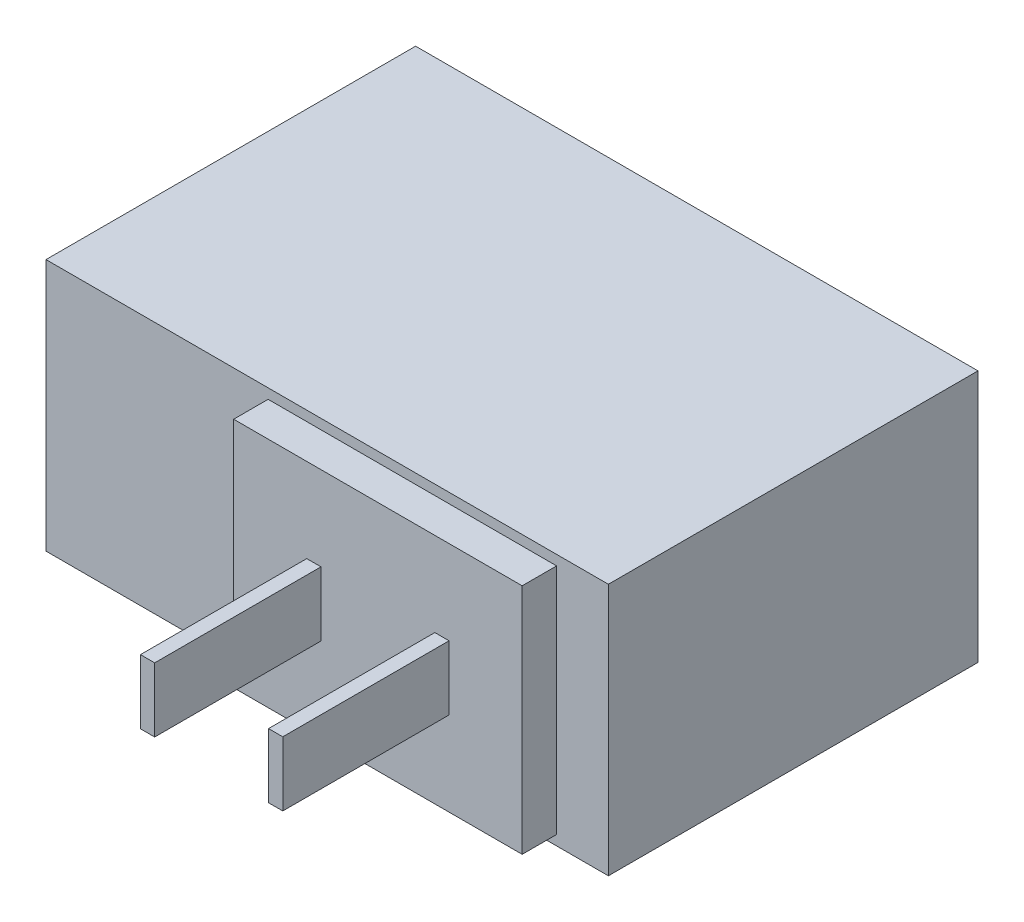
ISO-10303-21;
HEADER;
FILE_DESCRIPTION(('STEP AP214'),'2;1');
FILE_NAME('part.step','',(''),(''),'','','');
FILE_SCHEMA(('AUTOMOTIVE_DESIGN { 1 0 10303 214 1 1 1 1 }'));
ENDSEC;
DATA;
#1=APPLICATION_CONTEXT('core data for automotive mechanical design processes');
#2=APPLICATION_PROTOCOL_DEFINITION('international standard','automotive_design',2000,#1);
#3=PRODUCT_CONTEXT('',#1,'mechanical');
#4=PRODUCT('Part','Part','',(#3));
#5=PRODUCT_RELATED_PRODUCT_CATEGORY('part','',(#4));
#6=PRODUCT_DEFINITION_FORMATION('','',#4);
#7=PRODUCT_DEFINITION_CONTEXT('part definition',#1,'design');
#8=PRODUCT_DEFINITION('design','',#6,#7);
#9=PRODUCT_DEFINITION_SHAPE('','',#8);
#10=(LENGTH_UNIT() NAMED_UNIT(*) SI_UNIT(.MILLI.,.METRE.));
#11=(NAMED_UNIT(*) PLANE_ANGLE_UNIT() SI_UNIT($,.RADIAN.));
#12=(NAMED_UNIT(*) SI_UNIT($,.STERADIAN.) SOLID_ANGLE_UNIT());
#13=UNCERTAINTY_MEASURE_WITH_UNIT(LENGTH_MEASURE(1.E-05),#10,'distance_accuracy_value','');
#14=(GEOMETRIC_REPRESENTATION_CONTEXT(3) GLOBAL_UNCERTAINTY_ASSIGNED_CONTEXT((#13)) GLOBAL_UNIT_ASSIGNED_CONTEXT((#10,
#11,#12)) REPRESENTATION_CONTEXT('',''));
#15=CARTESIAN_POINT('',(0.,0.,0.));
#16=DIRECTION('',(0.,0.,1.));
#17=DIRECTION('',(1.,0.,0.));
#18=AXIS2_PLACEMENT_3D('',#15,#16,#17);
#19=CARTESIAN_POINT('',(0.,0.,39.75));
#20=DIRECTION('',(0.,0.,-1.));
#21=DIRECTION('',(-1.,0.,0.));
#22=AXIS2_PLACEMENT_3D('',#19,#20,#21);
#23=PLANE('',#22);
#24=DIRECTION('',(0.,-1.,0.));
#25=VECTOR('',#24,1.);
#26=CARTESIAN_POINT('',(13.98,3.15999999999999,39.75));
#27=LINE('',#26,#25);
#28=CARTESIAN_POINT('',(13.98,3.15999999999999,39.75));
#29=VERTEX_POINT('',#28);
#30=CARTESIAN_POINT('',(13.98,-3.16000000000001,39.75));
#31=VERTEX_POINT('',#30);
#32=EDGE_CURVE('E167',#29,#31,#27,.T.);
#33=ORIENTED_EDGE('',*,*,#32,.F.);
#34=DIRECTION('',(-1.,0.,0.));
#35=VECTOR('',#34,1.);
#36=CARTESIAN_POINT('',(13.98,3.15999999999999,39.75));
#37=LINE('',#36,#35);
#38=CARTESIAN_POINT('',(15.38,3.15999999999999,39.75));
#39=VERTEX_POINT('',#38);
#40=EDGE_CURVE('E180',#39,#29,#37,.T.);
#41=ORIENTED_EDGE('',*,*,#40,.F.);
#42=DIRECTION('',(0.,1.,0.));
#43=VECTOR('',#42,1.);
#44=CARTESIAN_POINT('',(15.38,3.15999999999999,39.75));
#45=LINE('',#44,#43);
#46=CARTESIAN_POINT('',(15.38,-3.16000000000001,39.75));
#47=VERTEX_POINT('',#46);
#48=EDGE_CURVE('E189',#47,#39,#45,.T.);
#49=ORIENTED_EDGE('',*,*,#48,.F.);
#50=DIRECTION('',(1.,0.,0.));
#51=VECTOR('',#50,1.);
#52=CARTESIAN_POINT('',(13.98,-3.16000000000001,39.75));
#53=LINE('',#52,#51);
#54=EDGE_CURVE('E170',#31,#47,#53,.T.);
#55=ORIENTED_EDGE('',*,*,#54,.F.);
#56=EDGE_LOOP('',(#33,#41,#49,#55));
#57=FACE_BOUND('',#56,.T.);
#58=DIRECTION('',(0.,1.,0.));
#59=VECTOR('',#58,1.);
#60=CARTESIAN_POINT('',(22.57,11.44,39.75));
#61=LINE('',#60,#59);
#62=CARTESIAN_POINT('',(22.57,-11.44,39.75));
#63=VERTEX_POINT('',#62);
#64=CARTESIAN_POINT('',(22.57,11.44,39.75));
#65=VERTEX_POINT('',#64);
#66=EDGE_CURVE('E206',#63,#65,#61,.T.);
#67=ORIENTED_EDGE('',*,*,#66,.T.);
#68=DIRECTION('',(-1.,0.,0.));
#69=VECTOR('',#68,1.);
#70=CARTESIAN_POINT('',(22.57,11.44,39.75));
#71=LINE('',#70,#69);
#72=CARTESIAN_POINT('',(-5.80999999999999,11.44,39.75));
#73=VERTEX_POINT('',#72);
#74=EDGE_CURVE('E209',#65,#73,#71,.T.);
#75=ORIENTED_EDGE('',*,*,#74,.T.);
#76=DIRECTION('',(0.,-1.,0.));
#77=VECTOR('',#76,1.);
#78=CARTESIAN_POINT('',(-5.80999999999999,11.44,39.75));
#79=LINE('',#78,#77);
#80=CARTESIAN_POINT('',(-5.80999999999999,-11.44,39.75));
#81=VERTEX_POINT('',#80);
#82=EDGE_CURVE('E212',#73,#81,#79,.T.);
#83=ORIENTED_EDGE('',*,*,#82,.T.);
#84=DIRECTION('',(1.,0.,0.));
#85=VECTOR('',#84,1.);
#86=CARTESIAN_POINT('',(22.57,-11.44,39.75));
#87=LINE('',#86,#85);
#88=EDGE_CURVE('E214',#81,#63,#87,.T.);
#89=ORIENTED_EDGE('',*,*,#88,.T.);
#90=EDGE_LOOP('',(#67,#75,#83,#89));
#91=FACE_BOUND('',#90,.T.);
#92=DIRECTION('',(0.,-1.,0.));
#93=VECTOR('',#92,1.);
#94=CARTESIAN_POINT('',(1.38000000000001,3.15999999999999,39.75));
#95=LINE('',#94,#93);
#96=CARTESIAN_POINT('',(1.38000000000001,3.15999999999999,39.75));
#97=VERTEX_POINT('',#96);
#98=CARTESIAN_POINT('',(1.38000000000001,-3.16000000000001,39.75));
#99=VERTEX_POINT('',#98);
#100=EDGE_CURVE('E166',#97,#99,#95,.T.);
#101=ORIENTED_EDGE('',*,*,#100,.F.);
#102=DIRECTION('',(-1.,0.,0.));
#103=VECTOR('',#102,1.);
#104=CARTESIAN_POINT('',(1.38000000000001,3.15999999999999,39.75));
#105=LINE('',#104,#103);
#106=CARTESIAN_POINT('',(2.78000000000001,3.15999999999999,39.75));
#107=VERTEX_POINT('',#106);
#108=EDGE_CURVE('E163',#107,#97,#105,.T.);
#109=ORIENTED_EDGE('',*,*,#108,.F.);
#110=DIRECTION('',(0.,1.,0.));
#111=VECTOR('',#110,1.);
#112=CARTESIAN_POINT('',(2.78000000000001,3.15999999999999,39.75));
#113=LINE('',#112,#111);
#114=CARTESIAN_POINT('',(2.78000000000001,-3.16000000000001,39.75));
#115=VERTEX_POINT('',#114);
#116=EDGE_CURVE('E53',#115,#107,#113,.T.);
#117=ORIENTED_EDGE('',*,*,#116,.F.);
#118=DIRECTION('',(1.,0.,0.));
#119=VECTOR('',#118,1.);
#120=CARTESIAN_POINT('',(1.38000000000001,-3.16000000000001,39.75));
#121=LINE('',#120,#119);
#122=EDGE_CURVE('E48',#99,#115,#121,.T.);
#123=ORIENTED_EDGE('',*,*,#122,.F.);
#124=EDGE_LOOP('',(#101,#109,#117,#123));
#125=FACE_BOUND('',#124,.T.);
#126=ADVANCED_FACE('F33',(#57,#91,#125),#23,.F.);
#127=CARTESIAN_POINT('',(-27.66,-12.42,36.36));
#128=DIRECTION('',(1.,0.,0.));
#129=DIRECTION('',(0.,0.,-1.));
#130=AXIS2_PLACEMENT_3D('',#127,#128,#129);
#131=PLANE('',#130);
#132=DIRECTION('',(0.,-1.,0.));
#133=VECTOR('',#132,1.);
#134=CARTESIAN_POINT('',(-27.66,-12.42,0.));
#135=LINE('',#134,#133);
#136=CARTESIAN_POINT('',(-27.66,12.42,0.));
#137=VERTEX_POINT('',#136);
#138=CARTESIAN_POINT('',(-27.66,-12.42,0.));
#139=VERTEX_POINT('',#138);
#140=EDGE_CURVE('E238',#137,#139,#135,.T.);
#141=ORIENTED_EDGE('',*,*,#140,.T.);
#142=DIRECTION('',(0.,0.,-1.));
#143=VECTOR('',#142,1.);
#144=CARTESIAN_POINT('',(-27.66,-12.42,36.36));
#145=LINE('',#144,#143);
#146=CARTESIAN_POINT('',(-27.66,-12.42,36.36));
#147=VERTEX_POINT('',#146);
#148=EDGE_CURVE('E11',#147,#139,#145,.T.);
#149=ORIENTED_EDGE('',*,*,#148,.F.);
#150=DIRECTION('',(0.,-1.,0.));
#151=VECTOR('',#150,1.);
#152=CARTESIAN_POINT('',(-27.66,-12.42,36.36));
#153=LINE('',#152,#151);
#154=CARTESIAN_POINT('',(-27.66,12.42,36.36));
#155=VERTEX_POINT('',#154);
#156=EDGE_CURVE('E239',#155,#147,#153,.T.);
#157=ORIENTED_EDGE('',*,*,#156,.F.);
#158=DIRECTION('',(0.,0.,-1.));
#159=VECTOR('',#158,1.);
#160=CARTESIAN_POINT('',(-27.66,12.42,36.36));
#161=LINE('',#160,#159);
#162=EDGE_CURVE('E249',#155,#137,#161,.T.);
#163=ORIENTED_EDGE('',*,*,#162,.T.);
#164=EDGE_LOOP('',(#141,#149,#157,#163));
#165=FACE_BOUND('',#164,.T.);
#166=ADVANCED_FACE('F35',(#165),#131,.F.);
#167=CARTESIAN_POINT('',(27.66,-12.42,36.36));
#168=DIRECTION('',(0.,1.,0.));
#169=DIRECTION('',(-1.,0.,0.));
#170=AXIS2_PLACEMENT_3D('',#167,#168,#169);
#171=PLANE('',#170);
#172=DIRECTION('',(1.,0.,0.));
#173=VECTOR('',#172,1.);
#174=CARTESIAN_POINT('',(27.66,-12.42,0.));
#175=LINE('',#174,#173);
#176=CARTESIAN_POINT('',(27.66,-12.42,0.));
#177=VERTEX_POINT('',#176);
#178=EDGE_CURVE('E252',#139,#177,#175,.T.);
#179=ORIENTED_EDGE('',*,*,#178,.T.);
#180=DIRECTION('',(0.,0.,-1.));
#181=VECTOR('',#180,1.);
#182=CARTESIAN_POINT('',(27.66,-12.42,36.36));
#183=LINE('',#182,#181);
#184=CARTESIAN_POINT('',(27.66,-12.42,36.36));
#185=VERTEX_POINT('',#184);
#186=EDGE_CURVE('E41',#185,#177,#183,.T.);
#187=ORIENTED_EDGE('',*,*,#186,.F.);
#188=DIRECTION('',(1.,0.,0.));
#189=VECTOR('',#188,1.);
#190=CARTESIAN_POINT('',(27.66,-12.42,36.36));
#191=LINE('',#190,#189);
#192=EDGE_CURVE('E242',#147,#185,#191,.T.);
#193=ORIENTED_EDGE('',*,*,#192,.F.);
#194=ORIENTED_EDGE('',*,*,#148,.T.);
#195=EDGE_LOOP('',(#179,#187,#193,#194));
#196=FACE_BOUND('',#195,.T.);
#197=ADVANCED_FACE('F282',(#196),#171,.F.);
#198=CARTESIAN_POINT('',(27.66,-12.42,36.36));
#199=DIRECTION('',(-1.,0.,0.));
#200=DIRECTION('',(0.,-1.,0.));
#201=AXIS2_PLACEMENT_3D('',#198,#199,#200);
#202=PLANE('',#201);
#203=DIRECTION('',(0.,1.,0.));
#204=VECTOR('',#203,1.);
#205=CARTESIAN_POINT('',(27.66,-12.42,0.));
#206=LINE('',#205,#204);
#207=CARTESIAN_POINT('',(27.66,12.42,0.));
#208=VERTEX_POINT('',#207);
#209=EDGE_CURVE('E254',#177,#208,#206,.T.);
#210=ORIENTED_EDGE('',*,*,#209,.T.);
#211=DIRECTION('',(0.,0.,-1.));
#212=VECTOR('',#211,1.);
#213=CARTESIAN_POINT('',(27.66,12.42,36.36));
#214=LINE('',#213,#212);
#215=CARTESIAN_POINT('',(27.66,12.42,36.36));
#216=VERTEX_POINT('',#215);
#217=EDGE_CURVE('E259',#216,#208,#214,.T.);
#218=ORIENTED_EDGE('',*,*,#217,.F.);
#219=DIRECTION('',(0.,1.,0.));
#220=VECTOR('',#219,1.);
#221=CARTESIAN_POINT('',(27.66,-12.42,36.36));
#222=LINE('',#221,#220);
#223=EDGE_CURVE('E245',#185,#216,#222,.T.);
#224=ORIENTED_EDGE('',*,*,#223,.F.);
#225=ORIENTED_EDGE('',*,*,#186,.T.);
#226=EDGE_LOOP('',(#210,#218,#224,#225));
#227=FACE_BOUND('',#226,.T.);
#228=ADVANCED_FACE('F266',(#227),#202,.F.);
#229=CARTESIAN_POINT('',(27.66,12.42,36.36));
#230=DIRECTION('',(0.,-1.,0.));
#231=DIRECTION('',(1.,0.,0.));
#232=AXIS2_PLACEMENT_3D('',#229,#230,#231);
#233=PLANE('',#232);
#234=DIRECTION('',(-1.,0.,0.));
#235=VECTOR('',#234,1.);
#236=CARTESIAN_POINT('',(27.66,12.42,0.));
#237=LINE('',#236,#235);
#238=EDGE_CURVE('E243',#208,#137,#237,.T.);
#239=ORIENTED_EDGE('',*,*,#238,.T.);
#240=ORIENTED_EDGE('',*,*,#162,.F.);
#241=DIRECTION('',(-1.,0.,0.));
#242=VECTOR('',#241,1.);
#243=CARTESIAN_POINT('',(27.66,12.42,36.36));
#244=LINE('',#243,#242);
#245=EDGE_CURVE('E247',#216,#155,#244,.T.);
#246=ORIENTED_EDGE('',*,*,#245,.F.);
#247=ORIENTED_EDGE('',*,*,#217,.T.);
#248=EDGE_LOOP('',(#239,#240,#246,#247));
#249=FACE_BOUND('',#248,.T.);
#250=ADVANCED_FACE('F275',(#249),#233,.F.);
#251=CARTESIAN_POINT('',(0.,0.,36.36));
#252=DIRECTION('',(0.,0.,1.));
#253=DIRECTION('',(1.,0.,0.));
#254=AXIS2_PLACEMENT_3D('',#251,#252,#253);
#255=PLANE('',#254);
#256=DIRECTION('',(0.,1.,0.));
#257=VECTOR('',#256,1.);
#258=CARTESIAN_POINT('',(22.57,11.44,36.36));
#259=LINE('',#258,#257);
#260=CARTESIAN_POINT('',(22.57,-11.44,36.36));
#261=VERTEX_POINT('',#260);
#262=CARTESIAN_POINT('',(22.57,11.44,36.36));
#263=VERTEX_POINT('',#262);
#264=EDGE_CURVE('E205',#261,#263,#259,.T.);
#265=ORIENTED_EDGE('',*,*,#264,.F.);
#266=DIRECTION('',(1.,0.,0.));
#267=VECTOR('',#266,1.);
#268=CARTESIAN_POINT('',(22.57,-11.44,36.36));
#269=LINE('',#268,#267);
#270=CARTESIAN_POINT('',(-5.80999999999999,-11.44,36.36));
#271=VERTEX_POINT('',#270);
#272=EDGE_CURVE('E210',#271,#261,#269,.T.);
#273=ORIENTED_EDGE('',*,*,#272,.F.);
#274=DIRECTION('',(0.,-1.,0.));
#275=VECTOR('',#274,1.);
#276=CARTESIAN_POINT('',(-5.80999999999999,11.44,36.36));
#277=LINE('',#276,#275);
#278=CARTESIAN_POINT('',(-5.80999999999999,11.44,36.36));
#279=VERTEX_POINT('',#278);
#280=EDGE_CURVE('E222',#279,#271,#277,.T.);
#281=ORIENTED_EDGE('',*,*,#280,.F.);
#282=DIRECTION('',(-1.,0.,0.));
#283=VECTOR('',#282,1.);
#284=CARTESIAN_POINT('',(22.57,11.44,36.36));
#285=LINE('',#284,#283);
#286=EDGE_CURVE('E219',#263,#279,#285,.T.);
#287=ORIENTED_EDGE('',*,*,#286,.F.);
#288=EDGE_LOOP('',(#265,#273,#281,#287));
#289=FACE_BOUND('',#288,.T.);
#290=ORIENTED_EDGE('',*,*,#156,.T.);
#291=ORIENTED_EDGE('',*,*,#192,.T.);
#292=ORIENTED_EDGE('',*,*,#223,.T.);
#293=ORIENTED_EDGE('',*,*,#245,.T.);
#294=EDGE_LOOP('',(#290,#291,#292,#293));
#295=FACE_BOUND('',#294,.T.);
#296=ADVANCED_FACE('F281',(#289,#295),#255,.T.);
#297=CARTESIAN_POINT('',(0.,0.,0.));
#298=DIRECTION('',(0.,0.,1.));
#299=DIRECTION('',(1.,0.,0.));
#300=AXIS2_PLACEMENT_3D('',#297,#298,#299);
#301=PLANE('',#300);
#302=ORIENTED_EDGE('',*,*,#140,.F.);
#303=ORIENTED_EDGE('',*,*,#238,.F.);
#304=ORIENTED_EDGE('',*,*,#209,.F.);
#305=ORIENTED_EDGE('',*,*,#178,.F.);
#306=EDGE_LOOP('',(#302,#303,#304,#305));
#307=FACE_BOUND('',#306,.T.);
#308=ADVANCED_FACE('F272',(#307),#301,.F.);
#309=CARTESIAN_POINT('',(22.57,11.44,39.75));
#310=DIRECTION('',(-1.,0.,0.));
#311=DIRECTION('',(0.,0.,1.));
#312=AXIS2_PLACEMENT_3D('',#309,#310,#311);
#313=PLANE('',#312);
#314=ORIENTED_EDGE('',*,*,#264,.T.);
#315=DIRECTION('',(0.,0.,-1.));
#316=VECTOR('',#315,1.);
#317=CARTESIAN_POINT('',(22.57,11.44,39.75));
#318=LINE('',#317,#316);
#319=EDGE_CURVE('E235',#65,#263,#318,.T.);
#320=ORIENTED_EDGE('',*,*,#319,.F.);
#321=ORIENTED_EDGE('',*,*,#66,.F.);
#322=DIRECTION('',(0.,0.,-1.));
#323=VECTOR('',#322,1.);
#324=CARTESIAN_POINT('',(22.57,-11.44,39.75));
#325=LINE('',#324,#323);
#326=EDGE_CURVE('E216',#63,#261,#325,.T.);
#327=ORIENTED_EDGE('',*,*,#326,.T.);
#328=EDGE_LOOP('',(#314,#320,#321,#327));
#329=FACE_BOUND('',#328,.T.);
#330=ADVANCED_FACE('F312',(#329),#313,.F.);
#331=CARTESIAN_POINT('',(22.57,11.44,39.75));
#332=DIRECTION('',(0.,-1.,0.));
#333=DIRECTION('',(0.,0.,-1.));
#334=AXIS2_PLACEMENT_3D('',#331,#332,#333);
#335=PLANE('',#334);
#336=ORIENTED_EDGE('',*,*,#286,.T.);
#337=DIRECTION('',(0.,0.,-1.));
#338=VECTOR('',#337,1.);
#339=CARTESIAN_POINT('',(-5.80999999999999,11.44,39.75));
#340=LINE('',#339,#338);
#341=EDGE_CURVE('E232',#73,#279,#340,.T.);
#342=ORIENTED_EDGE('',*,*,#341,.F.);
#343=ORIENTED_EDGE('',*,*,#74,.F.);
#344=ORIENTED_EDGE('',*,*,#319,.T.);
#345=EDGE_LOOP('',(#336,#342,#343,#344));
#346=FACE_BOUND('',#345,.T.);
#347=ADVANCED_FACE('F308',(#346),#335,.F.);
#348=CARTESIAN_POINT('',(-5.80999999999999,11.44,39.75));
#349=DIRECTION('',(1.,0.,0.));
#350=DIRECTION('',(0.,1.,0.));
#351=AXIS2_PLACEMENT_3D('',#348,#349,#350);
#352=PLANE('',#351);
#353=ORIENTED_EDGE('',*,*,#280,.T.);
#354=DIRECTION('',(0.,0.,-1.));
#355=VECTOR('',#354,1.);
#356=CARTESIAN_POINT('',(-5.80999999999999,-11.44,39.75));
#357=LINE('',#356,#355);
#358=EDGE_CURVE('E229',#81,#271,#357,.T.);
#359=ORIENTED_EDGE('',*,*,#358,.F.);
#360=ORIENTED_EDGE('',*,*,#82,.F.);
#361=ORIENTED_EDGE('',*,*,#341,.T.);
#362=EDGE_LOOP('',(#353,#359,#360,#361));
#363=FACE_BOUND('',#362,.T.);
#364=ADVANCED_FACE('F304',(#363),#352,.F.);
#365=CARTESIAN_POINT('',(22.57,-11.44,39.75));
#366=DIRECTION('',(0.,1.,0.));
#367=DIRECTION('',(0.,0.,1.));
#368=AXIS2_PLACEMENT_3D('',#365,#366,#367);
#369=PLANE('',#368);
#370=ORIENTED_EDGE('',*,*,#272,.T.);
#371=ORIENTED_EDGE('',*,*,#326,.F.);
#372=ORIENTED_EDGE('',*,*,#88,.F.);
#373=ORIENTED_EDGE('',*,*,#358,.T.);
#374=EDGE_LOOP('',(#370,#371,#372,#373));
#375=FACE_BOUND('',#374,.T.);
#376=ADVANCED_FACE('F301',(#375),#369,.F.);
#377=CARTESIAN_POINT('',(13.98,3.15999999999999,56.11));
#378=DIRECTION('',(1.,0.,0.));
#379=DIRECTION('',(0.,0.,-1.));
#380=AXIS2_PLACEMENT_3D('',#377,#378,#379);
#381=PLANE('',#380);
#382=ORIENTED_EDGE('',*,*,#32,.T.);
#383=DIRECTION('',(0.,0.,-1.));
#384=VECTOR('',#383,1.);
#385=CARTESIAN_POINT('',(13.98,-3.16000000000001,56.11));
#386=LINE('',#385,#384);
#387=CARTESIAN_POINT('',(13.98,-3.16000000000001,56.11));
#388=VERTEX_POINT('',#387);
#389=EDGE_CURVE('E202',#388,#31,#386,.T.);
#390=ORIENTED_EDGE('',*,*,#389,.F.);
#391=DIRECTION('',(0.,-1.,0.));
#392=VECTOR('',#391,1.);
#393=CARTESIAN_POINT('',(13.98,3.15999999999999,56.11));
#394=LINE('',#393,#392);
#395=CARTESIAN_POINT('',(13.98,3.15999999999999,56.11));
#396=VERTEX_POINT('',#395);
#397=EDGE_CURVE('E176',#396,#388,#394,.T.);
#398=ORIENTED_EDGE('',*,*,#397,.F.);
#399=DIRECTION('',(0.,0.,-1.));
#400=VECTOR('',#399,1.);
#401=CARTESIAN_POINT('',(13.98,3.15999999999999,56.11));
#402=LINE('',#401,#400);
#403=EDGE_CURVE('E185',#396,#29,#402,.T.);
#404=ORIENTED_EDGE('',*,*,#403,.T.);
#405=EDGE_LOOP('',(#382,#390,#398,#404));
#406=FACE_BOUND('',#405,.T.);
#407=ADVANCED_FACE('F299',(#406),#381,.F.);
#408=CARTESIAN_POINT('',(13.98,-3.16000000000001,56.11));
#409=DIRECTION('',(0.,1.,0.));
#410=DIRECTION('',(-1.,0.,0.));
#411=AXIS2_PLACEMENT_3D('',#408,#409,#410);
#412=PLANE('',#411);
#413=ORIENTED_EDGE('',*,*,#54,.T.);
#414=DIRECTION('',(0.,0.,-1.));
#415=VECTOR('',#414,1.);
#416=CARTESIAN_POINT('',(15.38,-3.16000000000001,56.11));
#417=LINE('',#416,#415);
#418=CARTESIAN_POINT('',(15.38,-3.16000000000001,56.11));
#419=VERTEX_POINT('',#418);
#420=EDGE_CURVE('E199',#419,#47,#417,.T.);
#421=ORIENTED_EDGE('',*,*,#420,.F.);
#422=DIRECTION('',(1.,0.,0.));
#423=VECTOR('',#422,1.);
#424=CARTESIAN_POINT('',(13.98,-3.16000000000001,56.11));
#425=LINE('',#424,#423);
#426=EDGE_CURVE('E179',#388,#419,#425,.T.);
#427=ORIENTED_EDGE('',*,*,#426,.F.);
#428=ORIENTED_EDGE('',*,*,#389,.T.);
#429=EDGE_LOOP('',(#413,#421,#427,#428));
#430=FACE_BOUND('',#429,.T.);
#431=ADVANCED_FACE('F369',(#430),#412,.F.);
#432=CARTESIAN_POINT('',(15.38,3.15999999999999,56.11));
#433=DIRECTION('',(-1.,0.,0.));
#434=DIRECTION('',(0.,0.,1.));
#435=AXIS2_PLACEMENT_3D('',#432,#433,#434);
#436=PLANE('',#435);
#437=ORIENTED_EDGE('',*,*,#48,.T.);
#438=DIRECTION('',(0.,0.,-1.));
#439=VECTOR('',#438,1.);
#440=CARTESIAN_POINT('',(15.38,3.15999999999999,56.11));
#441=LINE('',#440,#439);
#442=CARTESIAN_POINT('',(15.38,3.15999999999999,56.11));
#443=VERTEX_POINT('',#442);
#444=EDGE_CURVE('E196',#443,#39,#441,.T.);
#445=ORIENTED_EDGE('',*,*,#444,.F.);
#446=DIRECTION('',(0.,1.,0.));
#447=VECTOR('',#446,1.);
#448=CARTESIAN_POINT('',(15.38,3.15999999999999,56.11));
#449=LINE('',#448,#447);
#450=EDGE_CURVE('E182',#419,#443,#449,.T.);
#451=ORIENTED_EDGE('',*,*,#450,.F.);
#452=ORIENTED_EDGE('',*,*,#420,.T.);
#453=EDGE_LOOP('',(#437,#445,#451,#452));
#454=FACE_BOUND('',#453,.T.);
#455=ADVANCED_FACE('F377',(#454),#436,.F.);
#456=CARTESIAN_POINT('',(13.98,3.15999999999999,56.11));
#457=DIRECTION('',(0.,-1.,0.));
#458=DIRECTION('',(1.,0.,0.));
#459=AXIS2_PLACEMENT_3D('',#456,#457,#458);
#460=PLANE('',#459);
#461=ORIENTED_EDGE('',*,*,#40,.T.);
#462=ORIENTED_EDGE('',*,*,#403,.F.);
#463=DIRECTION('',(-1.,0.,0.));
#464=VECTOR('',#463,1.);
#465=CARTESIAN_POINT('',(13.98,3.15999999999999,56.11));
#466=LINE('',#465,#464);
#467=EDGE_CURVE('E184',#443,#396,#466,.T.);
#468=ORIENTED_EDGE('',*,*,#467,.F.);
#469=ORIENTED_EDGE('',*,*,#444,.T.);
#470=EDGE_LOOP('',(#461,#462,#468,#469));
#471=FACE_BOUND('',#470,.T.);
#472=ADVANCED_FACE('F385',(#471),#460,.F.);
#473=CARTESIAN_POINT('',(0.,0.,56.11));
#474=DIRECTION('',(0.,0.,1.));
#475=DIRECTION('',(1.,0.,0.));
#476=AXIS2_PLACEMENT_3D('',#473,#474,#475);
#477=PLANE('',#476);
#478=ORIENTED_EDGE('',*,*,#397,.T.);
#479=ORIENTED_EDGE('',*,*,#426,.T.);
#480=ORIENTED_EDGE('',*,*,#450,.T.);
#481=ORIENTED_EDGE('',*,*,#467,.T.);
#482=EDGE_LOOP('',(#478,#479,#480,#481));
#483=FACE_BOUND('',#482,.T.);
#484=ADVANCED_FACE('F394',(#483),#477,.T.);
#485=CARTESIAN_POINT('',(1.38000000000001,3.15999999999999,56.11));
#486=DIRECTION('',(1.,0.,0.));
#487=DIRECTION('',(0.,1.,0.));
#488=AXIS2_PLACEMENT_3D('',#485,#486,#487);
#489=PLANE('',#488);
#490=ORIENTED_EDGE('',*,*,#100,.T.);
#491=DIRECTION('',(0.,0.,-1.));
#492=VECTOR('',#491,1.);
#493=CARTESIAN_POINT('',(1.38000000000001,-3.16000000000001,56.11));
#494=LINE('',#493,#492);
#495=CARTESIAN_POINT('',(1.38000000000001,-3.16000000000001,56.11));
#496=VERTEX_POINT('',#495);
#497=EDGE_CURVE('E147',#496,#99,#494,.T.);
#498=ORIENTED_EDGE('',*,*,#497,.F.);
#499=DIRECTION('',(0.,-1.,0.));
#500=VECTOR('',#499,1.);
#501=CARTESIAN_POINT('',(1.38000000000001,3.15999999999999,56.11));
#502=LINE('',#501,#500);
#503=CARTESIAN_POINT('',(1.38000000000001,3.15999999999999,56.11));
#504=VERTEX_POINT('',#503);
#505=EDGE_CURVE('E154',#504,#496,#502,.T.);
#506=ORIENTED_EDGE('',*,*,#505,.F.);
#507=DIRECTION('',(0.,0.,-1.));
#508=VECTOR('',#507,1.);
#509=CARTESIAN_POINT('',(1.38000000000001,3.15999999999999,56.11));
#510=LINE('',#509,#508);
#511=EDGE_CURVE('E460',#504,#97,#510,.T.);
#512=ORIENTED_EDGE('',*,*,#511,.T.);
#513=EDGE_LOOP('',(#490,#498,#506,#512));
#514=FACE_BOUND('',#513,.T.);
#515=ADVANCED_FACE('F165',(#514),#489,.F.);
#516=CARTESIAN_POINT('',(1.38000000000001,-3.16000000000001,56.11));
#517=DIRECTION('',(0.,1.,0.));
#518=DIRECTION('',(0.,0.,1.));
#519=AXIS2_PLACEMENT_3D('',#516,#517,#518);
#520=PLANE('',#519);
#521=ORIENTED_EDGE('',*,*,#122,.T.);
#522=DIRECTION('',(0.,0.,-1.));
#523=VECTOR('',#522,1.);
#524=CARTESIAN_POINT('',(2.78000000000001,-3.16000000000001,56.11));
#525=LINE('',#524,#523);
#526=CARTESIAN_POINT('',(2.78000000000001,-3.16000000000001,56.11));
#527=VERTEX_POINT('',#526);
#528=EDGE_CURVE('E150',#527,#115,#525,.T.);
#529=ORIENTED_EDGE('',*,*,#528,.F.);
#530=DIRECTION('',(1.,0.,0.));
#531=VECTOR('',#530,1.);
#532=CARTESIAN_POINT('',(1.38000000000001,-3.16000000000001,56.11));
#533=LINE('',#532,#531);
#534=EDGE_CURVE('E143',#496,#527,#533,.T.);
#535=ORIENTED_EDGE('',*,*,#534,.F.);
#536=ORIENTED_EDGE('',*,*,#497,.T.);
#537=EDGE_LOOP('',(#521,#529,#535,#536));
#538=FACE_BOUND('',#537,.T.);
#539=ADVANCED_FACE('F145',(#538),#520,.F.);
#540=CARTESIAN_POINT('',(2.78000000000001,3.15999999999999,56.11));
#541=DIRECTION('',(-1.,0.,0.));
#542=DIRECTION('',(0.,-1.,0.));
#543=AXIS2_PLACEMENT_3D('',#540,#541,#542);
#544=PLANE('',#543);
#545=ORIENTED_EDGE('',*,*,#116,.T.);
#546=DIRECTION('',(0.,0.,-1.));
#547=VECTOR('',#546,1.);
#548=CARTESIAN_POINT('',(2.78000000000001,3.15999999999999,56.11));
#549=LINE('',#548,#547);
#550=CARTESIAN_POINT('',(2.78000000000001,3.15999999999999,56.11));
#551=VERTEX_POINT('',#550);
#552=EDGE_CURVE('E172',#551,#107,#549,.T.);
#553=ORIENTED_EDGE('',*,*,#552,.F.);
#554=DIRECTION('',(0.,1.,0.));
#555=VECTOR('',#554,1.);
#556=CARTESIAN_POINT('',(2.78000000000001,3.15999999999999,56.11));
#557=LINE('',#556,#555);
#558=EDGE_CURVE('E153',#527,#551,#557,.T.);
#559=ORIENTED_EDGE('',*,*,#558,.F.);
#560=ORIENTED_EDGE('',*,*,#528,.T.);
#561=EDGE_LOOP('',(#545,#553,#559,#560));
#562=FACE_BOUND('',#561,.T.);
#563=ADVANCED_FACE('F418',(#562),#544,.F.);
#564=CARTESIAN_POINT('',(1.38000000000001,3.15999999999999,56.11));
#565=DIRECTION('',(0.,-1.,0.));
#566=DIRECTION('',(0.,0.,-1.));
#567=AXIS2_PLACEMENT_3D('',#564,#565,#566);
#568=PLANE('',#567);
#569=ORIENTED_EDGE('',*,*,#108,.T.);
#570=ORIENTED_EDGE('',*,*,#511,.F.);
#571=DIRECTION('',(-1.,0.,0.));
#572=VECTOR('',#571,1.);
#573=CARTESIAN_POINT('',(1.38000000000001,3.15999999999999,56.11));
#574=LINE('',#573,#572);
#575=EDGE_CURVE('E159',#551,#504,#574,.T.);
#576=ORIENTED_EDGE('',*,*,#575,.F.);
#577=ORIENTED_EDGE('',*,*,#552,.T.);
#578=EDGE_LOOP('',(#569,#570,#576,#577));
#579=FACE_BOUND('',#578,.T.);
#580=ADVANCED_FACE('F426',(#579),#568,.F.);
#581=CARTESIAN_POINT('',(0.,0.,56.11));
#582=DIRECTION('',(0.,0.,1.));
#583=DIRECTION('',(1.,0.,0.));
#584=AXIS2_PLACEMENT_3D('',#581,#582,#583);
#585=PLANE('',#584);
#586=ORIENTED_EDGE('',*,*,#505,.T.);
#587=ORIENTED_EDGE('',*,*,#534,.T.);
#588=ORIENTED_EDGE('',*,*,#558,.T.);
#589=ORIENTED_EDGE('',*,*,#575,.T.);
#590=EDGE_LOOP('',(#586,#587,#588,#589));
#591=FACE_BOUND('',#590,.T.);
#592=ADVANCED_FACE('F157',(#591),#585,.T.);
#593=CLOSED_SHELL('',(#126,#166,#197,#228,#250,#296,#308,#330,#347,#364,#376,#407,#431,#455,
#472,#484,#515,#539,#563,#580,#592));
#594=MANIFOLD_SOLID_BREP('B2',#593);
#595=ADVANCED_BREP_SHAPE_REPRESENTATION('',(#18,#594),#14);
#596=SHAPE_DEFINITION_REPRESENTATION(#9,#595);
ENDSEC;
END-ISO-10303-21;
